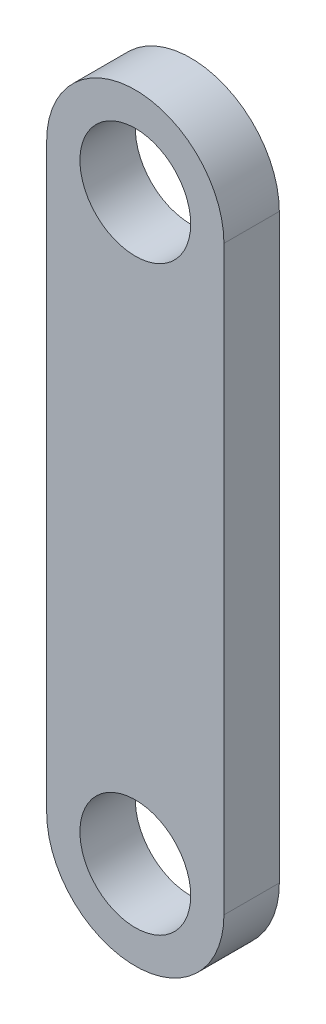
ISO-10303-21;
HEADER;
FILE_DESCRIPTION(('STEP AP214'),'2;1');
FILE_NAME('part.step','',(''),(''),'','','');
FILE_SCHEMA(('AUTOMOTIVE_DESIGN { 1 0 10303 214 1 1 1 1 }'));
ENDSEC;
DATA;
#1=APPLICATION_CONTEXT('core data for automotive mechanical design processes');
#2=APPLICATION_PROTOCOL_DEFINITION('international standard','automotive_design',2000,#1);
#3=PRODUCT_CONTEXT('',#1,'mechanical');
#4=PRODUCT('Part','Part','',(#3));
#5=PRODUCT_RELATED_PRODUCT_CATEGORY('part','',(#4));
#6=PRODUCT_DEFINITION_FORMATION('','',#4);
#7=PRODUCT_DEFINITION_CONTEXT('part definition',#1,'design');
#8=PRODUCT_DEFINITION('design','',#6,#7);
#9=PRODUCT_DEFINITION_SHAPE('','',#8);
#10=(LENGTH_UNIT() NAMED_UNIT(*) SI_UNIT(.MILLI.,.METRE.));
#11=(NAMED_UNIT(*) PLANE_ANGLE_UNIT() SI_UNIT($,.RADIAN.));
#12=(NAMED_UNIT(*) SI_UNIT($,.STERADIAN.) SOLID_ANGLE_UNIT());
#13=UNCERTAINTY_MEASURE_WITH_UNIT(LENGTH_MEASURE(1.E-05),#10,'distance_accuracy_value','');
#14=(GEOMETRIC_REPRESENTATION_CONTEXT(3) GLOBAL_UNCERTAINTY_ASSIGNED_CONTEXT((#13)) GLOBAL_UNIT_ASSIGNED_CONTEXT((#10,
#11,#12)) REPRESENTATION_CONTEXT('',''));
#15=CARTESIAN_POINT('',(0.,0.,0.));
#16=DIRECTION('',(0.,0.,1.));
#17=DIRECTION('',(1.,0.,0.));
#18=AXIS2_PLACEMENT_3D('',#15,#16,#17);
#19=CARTESIAN_POINT('',(0.,-2.625,0.5));
#20=DIRECTION('',(0.,0.,1.));
#21=DIRECTION('',(1.,0.,0.));
#22=AXIS2_PLACEMENT_3D('',#19,#20,#21);
#23=PLANE('',#22);
#24=CARTESIAN_POINT('',(0.,2.625,0.5));
#25=DIRECTION('',(0.,0.,1.));
#26=DIRECTION('',(1.,0.,0.));
#27=AXIS2_PLACEMENT_3D('',#24,#25,#26);
#28=CIRCLE('',#27,0.5);
#29=CARTESIAN_POINT('',(0.499999999999999,2.625,0.5));
#30=VERTEX_POINT('',#29);
#31=EDGE_CURVE('E100',#30,#30,#28,.T.);
#32=ORIENTED_EDGE('',*,*,#31,.F.);
#33=EDGE_LOOP('',(#32));
#34=FACE_BOUND('',#33,.T.);
#35=CARTESIAN_POINT('',(0.,-2.625,0.5));
#36=DIRECTION('',(0.,0.,1.));
#37=DIRECTION('',(1.,0.,0.));
#38=AXIS2_PLACEMENT_3D('',#35,#36,#37);
#39=CIRCLE('',#38,0.800000000000001);
#40=CARTESIAN_POINT('',(-0.800000000000001,-2.625,0.5));
#41=VERTEX_POINT('',#40);
#42=CARTESIAN_POINT('',(0.800000000000001,-2.625,0.5));
#43=VERTEX_POINT('',#42);
#44=EDGE_CURVE('E85',#41,#43,#39,.T.);
#45=ORIENTED_EDGE('',*,*,#44,.T.);
#46=DIRECTION('',(0.,1.,0.));
#47=VECTOR('',#46,1.);
#48=CARTESIAN_POINT('',(0.800000000000001,-2.625,0.5));
#49=LINE('',#48,#47);
#50=CARTESIAN_POINT('',(0.8,2.625,0.5));
#51=VERTEX_POINT('',#50);
#52=EDGE_CURVE('E80',#43,#51,#49,.T.);
#53=ORIENTED_EDGE('',*,*,#52,.T.);
#54=CARTESIAN_POINT('',(0.,2.625,0.5));
#55=DIRECTION('',(0.,0.,1.));
#56=DIRECTION('',(1.,0.,0.));
#57=AXIS2_PLACEMENT_3D('',#54,#55,#56);
#58=CIRCLE('',#57,0.800000000000001);
#59=CARTESIAN_POINT('',(-0.800000000000002,2.625,0.5));
#60=VERTEX_POINT('',#59);
#61=EDGE_CURVE('E83',#51,#60,#58,.T.);
#62=ORIENTED_EDGE('',*,*,#61,.T.);
#63=DIRECTION('',(0.,-1.,0.));
#64=VECTOR('',#63,1.);
#65=CARTESIAN_POINT('',(-0.800000000000001,-2.625,0.5));
#66=LINE('',#65,#64);
#67=EDGE_CURVE('E50',#60,#41,#66,.T.);
#68=ORIENTED_EDGE('',*,*,#67,.T.);
#69=EDGE_LOOP('',(#45,#53,#62,#68));
#70=FACE_BOUND('',#69,.T.);
#71=CARTESIAN_POINT('',(0.,-2.625,0.5));
#72=DIRECTION('',(0.,0.,1.));
#73=DIRECTION('',(1.,0.,0.));
#74=AXIS2_PLACEMENT_3D('',#71,#72,#73);
#75=CIRCLE('',#74,0.5);
#76=CARTESIAN_POINT('',(0.5,-2.625,0.5));
#77=VERTEX_POINT('',#76);
#78=EDGE_CURVE('E115',#77,#77,#75,.T.);
#79=ORIENTED_EDGE('',*,*,#78,.F.);
#80=EDGE_LOOP('',(#79));
#81=FACE_BOUND('',#80,.T.);
#82=ADVANCED_FACE('F33',(#34,#70,#81),#23,.T.);
#83=CARTESIAN_POINT('',(0.,-2.625,0.));
#84=DIRECTION('',(0.,0.,1.));
#85=DIRECTION('',(1.,0.,0.));
#86=AXIS2_PLACEMENT_3D('',#83,#84,#85);
#87=PLANE('',#86);
#88=CARTESIAN_POINT('',(0.,-2.625,0.));
#89=DIRECTION('',(0.,0.,1.));
#90=DIRECTION('',(1.,0.,0.));
#91=AXIS2_PLACEMENT_3D('',#88,#89,#90);
#92=CIRCLE('',#91,0.800000000000001);
#93=CARTESIAN_POINT('',(-0.800000000000001,-2.625,0.));
#94=VERTEX_POINT('',#93);
#95=CARTESIAN_POINT('',(0.800000000000001,-2.625,0.));
#96=VERTEX_POINT('',#95);
#97=EDGE_CURVE('E97',#94,#96,#92,.T.);
#98=ORIENTED_EDGE('',*,*,#97,.F.);
#99=DIRECTION('',(0.,-1.,0.));
#100=VECTOR('',#99,1.);
#101=CARTESIAN_POINT('',(-0.800000000000001,-2.625,0.));
#102=LINE('',#101,#100);
#103=CARTESIAN_POINT('',(-0.800000000000002,2.625,0.));
#104=VERTEX_POINT('',#103);
#105=EDGE_CURVE('E73',#104,#94,#102,.T.);
#106=ORIENTED_EDGE('',*,*,#105,.F.);
#107=CARTESIAN_POINT('',(0.,2.625,0.));
#108=DIRECTION('',(0.,0.,1.));
#109=DIRECTION('',(1.,0.,0.));
#110=AXIS2_PLACEMENT_3D('',#107,#108,#109);
#111=CIRCLE('',#110,0.800000000000001);
#112=CARTESIAN_POINT('',(0.8,2.625,0.));
#113=VERTEX_POINT('',#112);
#114=EDGE_CURVE('E67',#113,#104,#111,.T.);
#115=ORIENTED_EDGE('',*,*,#114,.F.);
#116=DIRECTION('',(0.,1.,0.));
#117=VECTOR('',#116,1.);
#118=CARTESIAN_POINT('',(0.800000000000001,-2.625,0.));
#119=LINE('',#118,#117);
#120=EDGE_CURVE('E89',#96,#113,#119,.T.);
#121=ORIENTED_EDGE('',*,*,#120,.F.);
#122=EDGE_LOOP('',(#98,#106,#115,#121));
#123=FACE_BOUND('',#122,.T.);
#124=CARTESIAN_POINT('',(0.,2.625,0.));
#125=DIRECTION('',(0.,0.,1.));
#126=DIRECTION('',(1.,0.,0.));
#127=AXIS2_PLACEMENT_3D('',#124,#125,#126);
#128=CIRCLE('',#127,0.5);
#129=CARTESIAN_POINT('',(0.499999999999999,2.625,0.));
#130=VERTEX_POINT('',#129);
#131=EDGE_CURVE('E112',#130,#130,#128,.T.);
#132=ORIENTED_EDGE('',*,*,#131,.T.);
#133=EDGE_LOOP('',(#132));
#134=FACE_BOUND('',#133,.T.);
#135=CARTESIAN_POINT('',(0.,-2.625,0.));
#136=DIRECTION('',(0.,0.,1.));
#137=DIRECTION('',(1.,0.,0.));
#138=AXIS2_PLACEMENT_3D('',#135,#136,#137);
#139=CIRCLE('',#138,0.5);
#140=CARTESIAN_POINT('',(0.5,-2.625,0.));
#141=VERTEX_POINT('',#140);
#142=EDGE_CURVE('E118',#141,#141,#139,.T.);
#143=ORIENTED_EDGE('',*,*,#142,.T.);
#144=EDGE_LOOP('',(#143));
#145=FACE_BOUND('',#144,.T.);
#146=ADVANCED_FACE('F108',(#123,#134,#145),#87,.F.);
#147=CARTESIAN_POINT('',(0.,-2.625,0.5));
#148=DIRECTION('',(0.,0.,-1.));
#149=DIRECTION('',(-1.,0.,0.));
#150=AXIS2_PLACEMENT_3D('',#147,#148,#149);
#151=CYLINDRICAL_SURFACE('',#150,0.800000000000001);
#152=ORIENTED_EDGE('',*,*,#97,.T.);
#153=DIRECTION('',(0.,0.,-1.));
#154=VECTOR('',#153,1.);
#155=CARTESIAN_POINT('',(0.800000000000001,-2.625,0.5));
#156=LINE('',#155,#154);
#157=EDGE_CURVE('E11',#43,#96,#156,.T.);
#158=ORIENTED_EDGE('',*,*,#157,.F.);
#159=ORIENTED_EDGE('',*,*,#44,.F.);
#160=DIRECTION('',(0.,0.,-1.));
#161=VECTOR('',#160,1.);
#162=CARTESIAN_POINT('',(-0.800000000000001,-2.625,0.5));
#163=LINE('',#162,#161);
#164=EDGE_CURVE('E93',#41,#94,#163,.T.);
#165=ORIENTED_EDGE('',*,*,#164,.T.);
#166=EDGE_LOOP('',(#152,#158,#159,#165));
#167=FACE_BOUND('',#166,.T.);
#168=ADVANCED_FACE('F35',(#167),#151,.T.);
#169=CARTESIAN_POINT('',(0.800000000000001,-2.625,0.5));
#170=DIRECTION('',(-1.,0.,0.));
#171=DIRECTION('',(0.,-1.,0.));
#172=AXIS2_PLACEMENT_3D('',#169,#170,#171);
#173=PLANE('',#172);
#174=ORIENTED_EDGE('',*,*,#120,.T.);
#175=DIRECTION('',(0.,0.,-1.));
#176=VECTOR('',#175,1.);
#177=CARTESIAN_POINT('',(0.8,2.625,0.5));
#178=LINE('',#177,#176);
#179=EDGE_CURVE('E42',#51,#113,#178,.T.);
#180=ORIENTED_EDGE('',*,*,#179,.F.);
#181=ORIENTED_EDGE('',*,*,#52,.F.);
#182=ORIENTED_EDGE('',*,*,#157,.T.);
#183=EDGE_LOOP('',(#174,#180,#181,#182));
#184=FACE_BOUND('',#183,.T.);
#185=ADVANCED_FACE('F88',(#184),#173,.F.);
#186=CARTESIAN_POINT('',(0.,2.625,0.5));
#187=DIRECTION('',(0.,0.,-1.));
#188=DIRECTION('',(-1.,0.,0.));
#189=AXIS2_PLACEMENT_3D('',#186,#187,#188);
#190=CYLINDRICAL_SURFACE('',#189,0.800000000000001);
#191=ORIENTED_EDGE('',*,*,#114,.T.);
#192=DIRECTION('',(0.,0.,-1.));
#193=VECTOR('',#192,1.);
#194=CARTESIAN_POINT('',(-0.800000000000002,2.625,0.5));
#195=LINE('',#194,#193);
#196=EDGE_CURVE('E90',#60,#104,#195,.T.);
#197=ORIENTED_EDGE('',*,*,#196,.F.);
#198=ORIENTED_EDGE('',*,*,#61,.F.);
#199=ORIENTED_EDGE('',*,*,#179,.T.);
#200=EDGE_LOOP('',(#191,#197,#198,#199));
#201=FACE_BOUND('',#200,.T.);
#202=ADVANCED_FACE('F91',(#201),#190,.T.);
#203=CARTESIAN_POINT('',(-0.800000000000001,-2.625,0.5));
#204=DIRECTION('',(1.,0.,0.));
#205=DIRECTION('',(0.,1.,0.));
#206=AXIS2_PLACEMENT_3D('',#203,#204,#205);
#207=PLANE('',#206);
#208=ORIENTED_EDGE('',*,*,#105,.T.);
#209=ORIENTED_EDGE('',*,*,#164,.F.);
#210=ORIENTED_EDGE('',*,*,#67,.F.);
#211=ORIENTED_EDGE('',*,*,#196,.T.);
#212=EDGE_LOOP('',(#208,#209,#210,#211));
#213=FACE_BOUND('',#212,.T.);
#214=ADVANCED_FACE('F105',(#213),#207,.F.);
#215=CARTESIAN_POINT('',(0.,2.625,0.5));
#216=DIRECTION('',(0.,0.,-1.));
#217=DIRECTION('',(-1.,0.,0.));
#218=AXIS2_PLACEMENT_3D('',#215,#216,#217);
#219=CYLINDRICAL_SURFACE('',#218,0.5);
#220=ORIENTED_EDGE('',*,*,#31,.T.);
#221=EDGE_LOOP('',(#220));
#222=FACE_BOUND('',#221,.T.);
#223=ORIENTED_EDGE('',*,*,#131,.F.);
#224=EDGE_LOOP('',(#223));
#225=FACE_BOUND('',#224,.T.);
#226=ADVANCED_FACE('F135',(#222,#225),#219,.F.);
#227=CARTESIAN_POINT('',(0.,-2.625,0.5));
#228=DIRECTION('',(0.,0.,-1.));
#229=DIRECTION('',(-1.,0.,0.));
#230=AXIS2_PLACEMENT_3D('',#227,#228,#229);
#231=CYLINDRICAL_SURFACE('',#230,0.5);
#232=ORIENTED_EDGE('',*,*,#78,.T.);
#233=EDGE_LOOP('',(#232));
#234=FACE_BOUND('',#233,.T.);
#235=ORIENTED_EDGE('',*,*,#142,.F.);
#236=EDGE_LOOP('',(#235));
#237=FACE_BOUND('',#236,.T.);
#238=ADVANCED_FACE('F124',(#234,#237),#231,.F.);
#239=CLOSED_SHELL('',(#82,#146,#168,#185,#202,#214,#226,#238));
#240=MANIFOLD_SOLID_BREP('B2',#239);
#241=ADVANCED_BREP_SHAPE_REPRESENTATION('',(#18,#240),#14);
#242=SHAPE_DEFINITION_REPRESENTATION(#9,#241);
ENDSEC;
END-ISO-10303-21;
